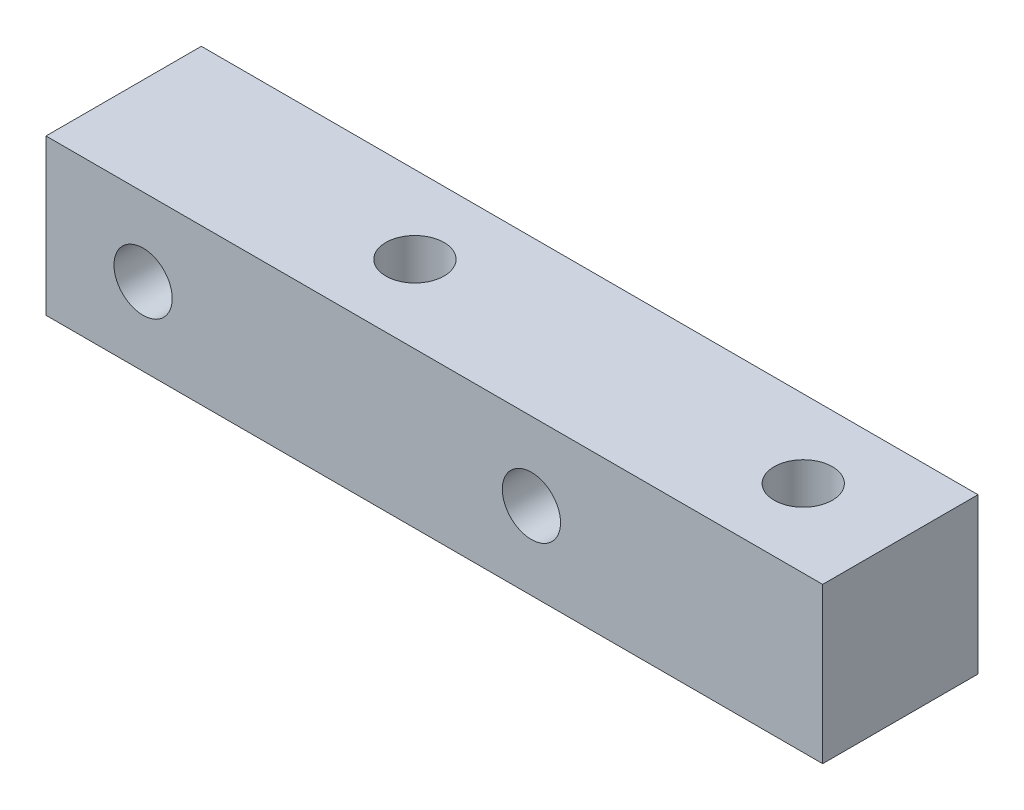
ISO-10303-21;
HEADER;
FILE_DESCRIPTION(('STEP AP214'),'2;1');
FILE_NAME('part.step','',(''),(''),'','','');
FILE_SCHEMA(('AUTOMOTIVE_DESIGN { 1 0 10303 214 1 1 1 1 }'));
ENDSEC;
DATA;
#1=APPLICATION_CONTEXT('core data for automotive mechanical design processes');
#2=APPLICATION_PROTOCOL_DEFINITION('international standard','automotive_design',2000,#1);
#3=PRODUCT_CONTEXT('',#1,'mechanical');
#4=PRODUCT('Part','Part','',(#3));
#5=PRODUCT_RELATED_PRODUCT_CATEGORY('part','',(#4));
#6=PRODUCT_DEFINITION_FORMATION('','',#4);
#7=PRODUCT_DEFINITION_CONTEXT('part definition',#1,'design');
#8=PRODUCT_DEFINITION('design','',#6,#7);
#9=PRODUCT_DEFINITION_SHAPE('','',#8);
#10=(LENGTH_UNIT() NAMED_UNIT(*) SI_UNIT(.MILLI.,.METRE.));
#11=(NAMED_UNIT(*) PLANE_ANGLE_UNIT() SI_UNIT($,.RADIAN.));
#12=(NAMED_UNIT(*) SI_UNIT($,.STERADIAN.) SOLID_ANGLE_UNIT());
#13=UNCERTAINTY_MEASURE_WITH_UNIT(LENGTH_MEASURE(1.E-05),#10,'distance_accuracy_value','');
#14=(GEOMETRIC_REPRESENTATION_CONTEXT(3) GLOBAL_UNCERTAINTY_ASSIGNED_CONTEXT((#13)) GLOBAL_UNIT_ASSIGNED_CONTEXT((#10,
#11,#12)) REPRESENTATION_CONTEXT('',''));
#15=CARTESIAN_POINT('',(0.,0.,0.));
#16=DIRECTION('',(0.,0.,1.));
#17=DIRECTION('',(1.,0.,0.));
#18=AXIS2_PLACEMENT_3D('',#15,#16,#17);
#19=CARTESIAN_POINT('',(0.,8.,0.));
#20=DIRECTION('',(0.,1.,0.));
#21=DIRECTION('',(0.,0.,1.));
#22=AXIS2_PLACEMENT_3D('',#19,#20,#21);
#23=PLANE('',#22);
#24=CARTESIAN_POINT('',(15.,8.,0.));
#25=DIRECTION('',(0.,1.,0.));
#26=DIRECTION('',(0.,0.,1.));
#27=AXIS2_PLACEMENT_3D('',#24,#25,#26);
#28=CIRCLE('',#27,1.5);
#29=CARTESIAN_POINT('',(15.,8.,1.5));
#30=VERTEX_POINT('',#29);
#31=EDGE_CURVE('E108',#30,#30,#28,.T.);
#32=ORIENTED_EDGE('',*,*,#31,.F.);
#33=EDGE_LOOP('',(#32));
#34=FACE_BOUND('',#33,.T.);
#35=DIRECTION('',(0.,0.,-1.));
#36=VECTOR('',#35,1.);
#37=CARTESIAN_POINT('',(20.,8.,-4.));
#38=LINE('',#37,#36);
#39=CARTESIAN_POINT('',(20.,8.,4.));
#40=VERTEX_POINT('',#39);
#41=CARTESIAN_POINT('',(20.,8.,-4.));
#42=VERTEX_POINT('',#41);
#43=EDGE_CURVE('E93',#40,#42,#38,.T.);
#44=ORIENTED_EDGE('',*,*,#43,.T.);
#45=DIRECTION('',(-1.,0.,0.));
#46=VECTOR('',#45,1.);
#47=CARTESIAN_POINT('',(-20.,8.,-4.));
#48=LINE('',#47,#46);
#49=CARTESIAN_POINT('',(-20.,8.,-4.));
#50=VERTEX_POINT('',#49);
#51=EDGE_CURVE('E88',#42,#50,#48,.T.);
#52=ORIENTED_EDGE('',*,*,#51,.T.);
#53=DIRECTION('',(0.,0.,1.));
#54=VECTOR('',#53,1.);
#55=CARTESIAN_POINT('',(-20.,8.,-4.));
#56=LINE('',#55,#54);
#57=CARTESIAN_POINT('',(-20.,8.,4.));
#58=VERTEX_POINT('',#57);
#59=EDGE_CURVE('E91',#50,#58,#56,.T.);
#60=ORIENTED_EDGE('',*,*,#59,.T.);
#61=DIRECTION('',(1.,0.,0.));
#62=VECTOR('',#61,1.);
#63=CARTESIAN_POINT('',(-20.,8.,4.));
#64=LINE('',#63,#62);
#65=EDGE_CURVE('E58',#58,#40,#64,.T.);
#66=ORIENTED_EDGE('',*,*,#65,.T.);
#67=EDGE_LOOP('',(#44,#52,#60,#66));
#68=FACE_BOUND('',#67,.T.);
#69=CARTESIAN_POINT('',(-5.,8.,0.));
#70=DIRECTION('',(0.,1.,0.));
#71=DIRECTION('',(0.,0.,1.));
#72=AXIS2_PLACEMENT_3D('',#69,#70,#71);
#73=CIRCLE('',#72,1.5);
#74=CARTESIAN_POINT('',(-5.,8.,1.5));
#75=VERTEX_POINT('',#74);
#76=EDGE_CURVE('E123',#75,#75,#73,.T.);
#77=ORIENTED_EDGE('',*,*,#76,.F.);
#78=EDGE_LOOP('',(#77));
#79=FACE_BOUND('',#78,.T.);
#80=ADVANCED_FACE('F41',(#34,#68,#79),#23,.T.);
#81=CARTESIAN_POINT('',(0.,0.,0.));
#82=DIRECTION('',(0.,1.,0.));
#83=DIRECTION('',(0.,0.,1.));
#84=AXIS2_PLACEMENT_3D('',#81,#82,#83);
#85=PLANE('',#84);
#86=DIRECTION('',(0.,0.,-1.));
#87=VECTOR('',#86,1.);
#88=CARTESIAN_POINT('',(20.,0.,-4.));
#89=LINE('',#88,#87);
#90=CARTESIAN_POINT('',(20.,0.,4.));
#91=VERTEX_POINT('',#90);
#92=CARTESIAN_POINT('',(20.,0.,-4.));
#93=VERTEX_POINT('',#92);
#94=EDGE_CURVE('E105',#91,#93,#89,.T.);
#95=ORIENTED_EDGE('',*,*,#94,.F.);
#96=DIRECTION('',(1.,0.,0.));
#97=VECTOR('',#96,1.);
#98=CARTESIAN_POINT('',(-20.,0.,4.));
#99=LINE('',#98,#97);
#100=CARTESIAN_POINT('',(-20.,0.,4.));
#101=VERTEX_POINT('',#100);
#102=EDGE_CURVE('E81',#101,#91,#99,.T.);
#103=ORIENTED_EDGE('',*,*,#102,.F.);
#104=DIRECTION('',(0.,0.,1.));
#105=VECTOR('',#104,1.);
#106=CARTESIAN_POINT('',(-20.,0.,-4.));
#107=LINE('',#106,#105);
#108=CARTESIAN_POINT('',(-20.,0.,-4.));
#109=VERTEX_POINT('',#108);
#110=EDGE_CURVE('E75',#109,#101,#107,.T.);
#111=ORIENTED_EDGE('',*,*,#110,.F.);
#112=DIRECTION('',(-1.,0.,0.));
#113=VECTOR('',#112,1.);
#114=CARTESIAN_POINT('',(-20.,0.,-4.));
#115=LINE('',#114,#113);
#116=EDGE_CURVE('E97',#93,#109,#115,.T.);
#117=ORIENTED_EDGE('',*,*,#116,.F.);
#118=EDGE_LOOP('',(#95,#103,#111,#117));
#119=FACE_BOUND('',#118,.T.);
#120=CARTESIAN_POINT('',(15.,0.,0.));
#121=DIRECTION('',(0.,1.,0.));
#122=DIRECTION('',(0.,0.,1.));
#123=AXIS2_PLACEMENT_3D('',#120,#121,#122);
#124=CIRCLE('',#123,1.5);
#125=CARTESIAN_POINT('',(15.,0.,1.5));
#126=VERTEX_POINT('',#125);
#127=EDGE_CURVE('E120',#126,#126,#124,.T.);
#128=ORIENTED_EDGE('',*,*,#127,.T.);
#129=EDGE_LOOP('',(#128));
#130=FACE_BOUND('',#129,.T.);
#131=CARTESIAN_POINT('',(-5.,0.,0.));
#132=DIRECTION('',(0.,1.,0.));
#133=DIRECTION('',(0.,0.,1.));
#134=AXIS2_PLACEMENT_3D('',#131,#132,#133);
#135=CIRCLE('',#134,1.5);
#136=CARTESIAN_POINT('',(-5.,0.,1.5));
#137=VERTEX_POINT('',#136);
#138=EDGE_CURVE('E126',#137,#137,#135,.T.);
#139=ORIENTED_EDGE('',*,*,#138,.T.);
#140=EDGE_LOOP('',(#139));
#141=FACE_BOUND('',#140,.T.);
#142=ADVANCED_FACE('F116',(#119,#130,#141),#85,.F.);
#143=CARTESIAN_POINT('',(20.,8.,-4.));
#144=DIRECTION('',(-1.,0.,0.));
#145=DIRECTION('',(0.,0.,1.));
#146=AXIS2_PLACEMENT_3D('',#143,#144,#145);
#147=PLANE('',#146);
#148=ORIENTED_EDGE('',*,*,#94,.T.);
#149=DIRECTION('',(0.,-1.,0.));
#150=VECTOR('',#149,1.);
#151=CARTESIAN_POINT('',(20.,8.,-4.));
#152=LINE('',#151,#150);
#153=EDGE_CURVE('E11',#42,#93,#152,.T.);
#154=ORIENTED_EDGE('',*,*,#153,.F.);
#155=ORIENTED_EDGE('',*,*,#43,.F.);
#156=DIRECTION('',(0.,-1.,0.));
#157=VECTOR('',#156,1.);
#158=CARTESIAN_POINT('',(20.,8.,4.));
#159=LINE('',#158,#157);
#160=EDGE_CURVE('E101',#40,#91,#159,.T.);
#161=ORIENTED_EDGE('',*,*,#160,.T.);
#162=EDGE_LOOP('',(#148,#154,#155,#161));
#163=FACE_BOUND('',#162,.T.);
#164=ADVANCED_FACE('F43',(#163),#147,.F.);
#165=CARTESIAN_POINT('',(-20.,8.,-4.));
#166=DIRECTION('',(0.,0.,1.));
#167=DIRECTION('',(1.,0.,0.));
#168=AXIS2_PLACEMENT_3D('',#165,#166,#167);
#169=PLANE('',#168);
#170=CARTESIAN_POINT('',(-15.,4.,-4.));
#171=DIRECTION('',(0.,0.,1.));
#172=DIRECTION('',(1.,0.,0.));
#173=AXIS2_PLACEMENT_3D('',#170,#171,#172);
#174=CIRCLE('',#173,1.5);
#175=CARTESIAN_POINT('',(-13.5,4.,-4.));
#176=VERTEX_POINT('',#175);
#177=EDGE_CURVE('E129',#176,#176,#174,.T.);
#178=ORIENTED_EDGE('',*,*,#177,.T.);
#179=EDGE_LOOP('',(#178));
#180=FACE_BOUND('',#179,.T.);
#181=CARTESIAN_POINT('',(5.,4.,-4.));
#182=DIRECTION('',(0.,0.,1.));
#183=DIRECTION('',(1.,0.,0.));
#184=AXIS2_PLACEMENT_3D('',#181,#182,#183);
#185=CIRCLE('',#184,1.5);
#186=CARTESIAN_POINT('',(6.5,4.,-4.));
#187=VERTEX_POINT('',#186);
#188=EDGE_CURVE('E132',#187,#187,#185,.T.);
#189=ORIENTED_EDGE('',*,*,#188,.T.);
#190=EDGE_LOOP('',(#189));
#191=FACE_BOUND('',#190,.T.);
#192=ORIENTED_EDGE('',*,*,#116,.T.);
#193=DIRECTION('',(0.,-1.,0.));
#194=VECTOR('',#193,1.);
#195=CARTESIAN_POINT('',(-20.,8.,-4.));
#196=LINE('',#195,#194);
#197=EDGE_CURVE('E50',#50,#109,#196,.T.);
#198=ORIENTED_EDGE('',*,*,#197,.F.);
#199=ORIENTED_EDGE('',*,*,#51,.F.);
#200=ORIENTED_EDGE('',*,*,#153,.T.);
#201=EDGE_LOOP('',(#192,#198,#199,#200));
#202=FACE_BOUND('',#201,.T.);
#203=ADVANCED_FACE('F96',(#180,#191,#202),#169,.F.);
#204=CARTESIAN_POINT('',(-20.,8.,-4.));
#205=DIRECTION('',(1.,0.,0.));
#206=DIRECTION('',(0.,0.,-1.));
#207=AXIS2_PLACEMENT_3D('',#204,#205,#206);
#208=PLANE('',#207);
#209=ORIENTED_EDGE('',*,*,#110,.T.);
#210=DIRECTION('',(0.,-1.,0.));
#211=VECTOR('',#210,1.);
#212=CARTESIAN_POINT('',(-20.,8.,4.));
#213=LINE('',#212,#211);
#214=EDGE_CURVE('E98',#58,#101,#213,.T.);
#215=ORIENTED_EDGE('',*,*,#214,.F.);
#216=ORIENTED_EDGE('',*,*,#59,.F.);
#217=ORIENTED_EDGE('',*,*,#197,.T.);
#218=EDGE_LOOP('',(#209,#215,#216,#217));
#219=FACE_BOUND('',#218,.T.);
#220=ADVANCED_FACE('F99',(#219),#208,.F.);
#221=CARTESIAN_POINT('',(-20.,8.,4.));
#222=DIRECTION('',(0.,0.,-1.));
#223=DIRECTION('',(-1.,0.,0.));
#224=AXIS2_PLACEMENT_3D('',#221,#222,#223);
#225=PLANE('',#224);
#226=CARTESIAN_POINT('',(-15.,4.,4.));
#227=DIRECTION('',(0.,0.,1.));
#228=DIRECTION('',(1.,0.,0.));
#229=AXIS2_PLACEMENT_3D('',#226,#227,#228);
#230=CIRCLE('',#229,1.5);
#231=CARTESIAN_POINT('',(-13.5,4.,4.));
#232=VERTEX_POINT('',#231);
#233=EDGE_CURVE('E138',#232,#232,#230,.T.);
#234=ORIENTED_EDGE('',*,*,#233,.F.);
#235=EDGE_LOOP('',(#234));
#236=FACE_BOUND('',#235,.T.);
#237=CARTESIAN_POINT('',(5.,4.,4.));
#238=DIRECTION('',(0.,0.,1.));
#239=DIRECTION('',(1.,0.,0.));
#240=AXIS2_PLACEMENT_3D('',#237,#238,#239);
#241=CIRCLE('',#240,1.5);
#242=CARTESIAN_POINT('',(6.5,4.,4.));
#243=VERTEX_POINT('',#242);
#244=EDGE_CURVE('E135',#243,#243,#241,.T.);
#245=ORIENTED_EDGE('',*,*,#244,.F.);
#246=EDGE_LOOP('',(#245));
#247=FACE_BOUND('',#246,.T.);
#248=ORIENTED_EDGE('',*,*,#102,.T.);
#249=ORIENTED_EDGE('',*,*,#160,.F.);
#250=ORIENTED_EDGE('',*,*,#65,.F.);
#251=ORIENTED_EDGE('',*,*,#214,.T.);
#252=EDGE_LOOP('',(#248,#249,#250,#251));
#253=FACE_BOUND('',#252,.T.);
#254=ADVANCED_FACE('F113',(#236,#247,#253),#225,.F.);
#255=CARTESIAN_POINT('',(15.,8.,0.));
#256=DIRECTION('',(0.,-1.,0.));
#257=DIRECTION('',(0.,0.,-1.));
#258=AXIS2_PLACEMENT_3D('',#255,#256,#257);
#259=CYLINDRICAL_SURFACE('',#258,1.5);
#260=ORIENTED_EDGE('',*,*,#31,.T.);
#261=EDGE_LOOP('',(#260));
#262=FACE_BOUND('',#261,.T.);
#263=ORIENTED_EDGE('',*,*,#127,.F.);
#264=EDGE_LOOP('',(#263));
#265=FACE_BOUND('',#264,.T.);
#266=ADVANCED_FACE('F155',(#262,#265),#259,.F.);
#267=CARTESIAN_POINT('',(-5.,8.,0.));
#268=DIRECTION('',(0.,-1.,0.));
#269=DIRECTION('',(0.,0.,-1.));
#270=AXIS2_PLACEMENT_3D('',#267,#268,#269);
#271=CYLINDRICAL_SURFACE('',#270,1.5);
#272=ORIENTED_EDGE('',*,*,#76,.T.);
#273=EDGE_LOOP('',(#272));
#274=FACE_BOUND('',#273,.T.);
#275=ORIENTED_EDGE('',*,*,#138,.F.);
#276=EDGE_LOOP('',(#275));
#277=FACE_BOUND('',#276,.T.);
#278=ADVANCED_FACE('F160',(#274,#277),#271,.F.);
#279=CARTESIAN_POINT('',(5.,4.,-4.));
#280=DIRECTION('',(0.,0.,1.));
#281=DIRECTION('',(1.,0.,0.));
#282=AXIS2_PLACEMENT_3D('',#279,#280,#281);
#283=CYLINDRICAL_SURFACE('',#282,1.5);
#284=ORIENTED_EDGE('',*,*,#188,.F.);
#285=EDGE_LOOP('',(#284));
#286=FACE_BOUND('',#285,.T.);
#287=ORIENTED_EDGE('',*,*,#244,.T.);
#288=EDGE_LOOP('',(#287));
#289=FACE_BOUND('',#288,.T.);
#290=ADVANCED_FACE('F149',(#286,#289),#283,.F.);
#291=CARTESIAN_POINT('',(-15.,4.,-4.));
#292=DIRECTION('',(0.,0.,1.));
#293=DIRECTION('',(1.,0.,0.));
#294=AXIS2_PLACEMENT_3D('',#291,#292,#293);
#295=CYLINDRICAL_SURFACE('',#294,1.5);
#296=ORIENTED_EDGE('',*,*,#177,.F.);
#297=EDGE_LOOP('',(#296));
#298=FACE_BOUND('',#297,.T.);
#299=ORIENTED_EDGE('',*,*,#233,.T.);
#300=EDGE_LOOP('',(#299));
#301=FACE_BOUND('',#300,.T.);
#302=ADVANCED_FACE('F146',(#298,#301),#295,.F.);
#303=CLOSED_SHELL('',(#80,#142,#164,#203,#220,#254,#266,#278,#290,#302));
#304=MANIFOLD_SOLID_BREP('B2',#303);
#305=ADVANCED_BREP_SHAPE_REPRESENTATION('',(#18,#304),#14);
#306=SHAPE_DEFINITION_REPRESENTATION(#9,#305);
ENDSEC;
END-ISO-10303-21;
